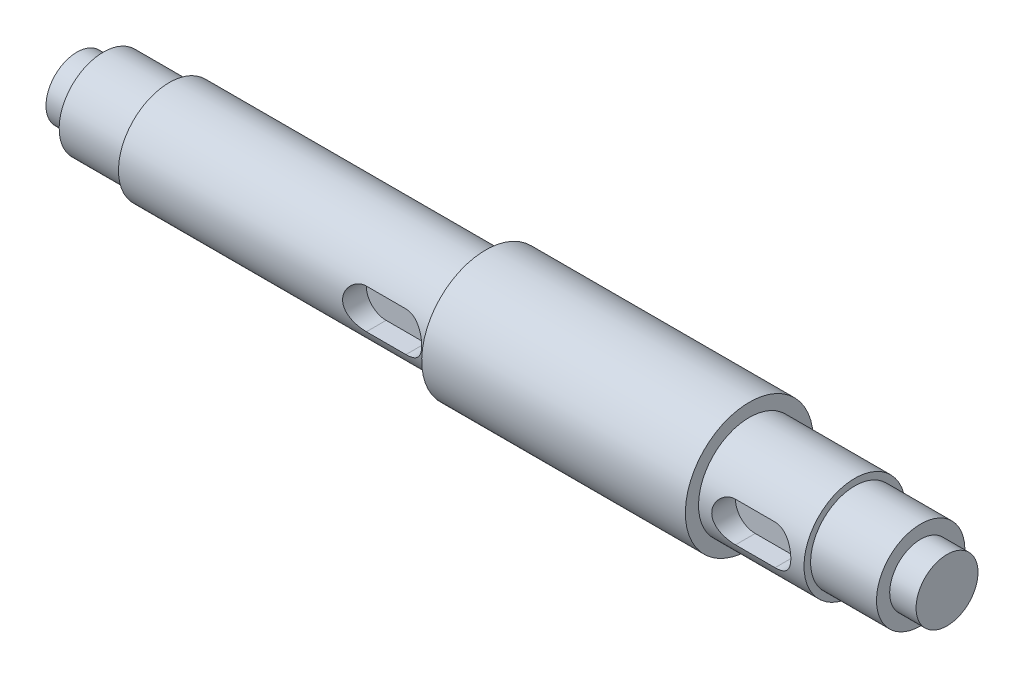
ISO-10303-21;
HEADER;
FILE_DESCRIPTION(('STEP AP214'),'2;1');
FILE_NAME('part.step','',(''),(''),'','','');
FILE_SCHEMA(('AUTOMOTIVE_DESIGN { 1 0 10303 214 1 1 1 1 }'));
ENDSEC;
DATA;
#1=APPLICATION_CONTEXT('core data for automotive mechanical design processes');
#2=APPLICATION_PROTOCOL_DEFINITION('international standard','automotive_design',2000,#1);
#3=PRODUCT_CONTEXT('',#1,'mechanical');
#4=PRODUCT('Part','Part','',(#3));
#5=PRODUCT_RELATED_PRODUCT_CATEGORY('part','',(#4));
#6=PRODUCT_DEFINITION_FORMATION('','',#4);
#7=PRODUCT_DEFINITION_CONTEXT('part definition',#1,'design');
#8=PRODUCT_DEFINITION('design','',#6,#7);
#9=PRODUCT_DEFINITION_SHAPE('','',#8);
#10=(LENGTH_UNIT() NAMED_UNIT(*) SI_UNIT(.MILLI.,.METRE.));
#11=(NAMED_UNIT(*) PLANE_ANGLE_UNIT() SI_UNIT($,.RADIAN.));
#12=(NAMED_UNIT(*) SI_UNIT($,.STERADIAN.) SOLID_ANGLE_UNIT());
#13=UNCERTAINTY_MEASURE_WITH_UNIT(LENGTH_MEASURE(1.E-05),#10,'distance_accuracy_value','');
#14=(GEOMETRIC_REPRESENTATION_CONTEXT(3) GLOBAL_UNCERTAINTY_ASSIGNED_CONTEXT((#13)) GLOBAL_UNIT_ASSIGNED_CONTEXT((#10,
#11,#12)) REPRESENTATION_CONTEXT('',''));
#15=CARTESIAN_POINT('',(0.,0.,0.));
#16=DIRECTION('',(0.,0.,1.));
#17=DIRECTION('',(1.,0.,0.));
#18=AXIS2_PLACEMENT_3D('',#15,#16,#17);
#19=CARTESIAN_POINT('',(66.,0.,0.));
#20=DIRECTION('',(-1.,0.,0.));
#21=DIRECTION('',(0.,-1.,0.));
#22=AXIS2_PLACEMENT_3D('',#19,#20,#21);
#23=PLANE('',#22);
#24=CARTESIAN_POINT('',(66.,0.,0.));
#25=DIRECTION('',(-1.,0.,0.));
#26=DIRECTION('',(0.,-1.,0.));
#27=AXIS2_PLACEMENT_3D('',#24,#25,#26);
#28=CIRCLE('',#27,2.35);
#29=CARTESIAN_POINT('',(66.,-2.34999999999999,0.));
#30=VERTEX_POINT('',#29);
#31=EDGE_CURVE('E230',#30,#30,#28,.T.);
#32=ORIENTED_EDGE('',*,*,#31,.F.);
#33=EDGE_LOOP('',(#32));
#34=FACE_BOUND('',#33,.T.);
#35=ADVANCED_FACE('F42',(#34),#23,.F.);
#36=CARTESIAN_POINT('',(0.,0.,0.));
#37=DIRECTION('',(-1.,0.,0.));
#38=DIRECTION('',(0.,-1.,0.));
#39=AXIS2_PLACEMENT_3D('',#36,#37,#38);
#40=CYLINDRICAL_SURFACE('',#39,2.35);
#41=CARTESIAN_POINT('',(64.,0.,0.));
#42=DIRECTION('',(-1.,0.,0.));
#43=DIRECTION('',(0.,-1.,0.));
#44=AXIS2_PLACEMENT_3D('',#41,#42,#43);
#45=CIRCLE('',#44,2.35);
#46=CARTESIAN_POINT('',(64.,-2.34999999999999,0.));
#47=VERTEX_POINT('',#46);
#48=EDGE_CURVE('E226',#47,#47,#45,.T.);
#49=ORIENTED_EDGE('',*,*,#48,.F.);
#50=EDGE_LOOP('',(#49));
#51=FACE_BOUND('',#50,.T.);
#52=ORIENTED_EDGE('',*,*,#31,.T.);
#53=EDGE_LOOP('',(#52));
#54=FACE_BOUND('',#53,.T.);
#55=ADVANCED_FACE('F307',(#51,#54),#40,.T.);
#56=CARTESIAN_POINT('',(64.,2.35000000000001,0.));
#57=DIRECTION('',(-1.,0.,0.));
#58=DIRECTION('',(0.,-1.,0.));
#59=AXIS2_PLACEMENT_3D('',#56,#57,#58);
#60=PLANE('',#59);
#61=CARTESIAN_POINT('',(64.,0.,0.));
#62=DIRECTION('',(-1.,0.,0.));
#63=DIRECTION('',(0.,-1.,0.));
#64=AXIS2_PLACEMENT_3D('',#61,#62,#63);
#65=CIRCLE('',#64,3.35);
#66=CARTESIAN_POINT('',(64.,-3.34999999999999,0.));
#67=VERTEX_POINT('',#66);
#68=EDGE_CURVE('E222',#67,#67,#65,.T.);
#69=ORIENTED_EDGE('',*,*,#68,.F.);
#70=EDGE_LOOP('',(#69));
#71=FACE_BOUND('',#70,.T.);
#72=ORIENTED_EDGE('',*,*,#48,.T.);
#73=EDGE_LOOP('',(#72));
#74=FACE_BOUND('',#73,.T.);
#75=ADVANCED_FACE('F304',(#71,#74),#60,.F.);
#76=CARTESIAN_POINT('',(0.,0.,0.));
#77=DIRECTION('',(-1.,0.,0.));
#78=DIRECTION('',(0.,-1.,0.));
#79=AXIS2_PLACEMENT_3D('',#76,#77,#78);
#80=CYLINDRICAL_SURFACE('',#79,3.35);
#81=CARTESIAN_POINT('',(59.,0.,0.));
#82=DIRECTION('',(-1.,0.,0.));
#83=DIRECTION('',(0.,-1.,0.));
#84=AXIS2_PLACEMENT_3D('',#81,#82,#83);
#85=CIRCLE('',#84,3.35);
#86=CARTESIAN_POINT('',(59.,-3.34999999999999,0.));
#87=VERTEX_POINT('',#86);
#88=EDGE_CURVE('E218',#87,#87,#85,.T.);
#89=ORIENTED_EDGE('',*,*,#88,.F.);
#90=EDGE_LOOP('',(#89));
#91=FACE_BOUND('',#90,.T.);
#92=ORIENTED_EDGE('',*,*,#68,.T.);
#93=EDGE_LOOP('',(#92));
#94=FACE_BOUND('',#93,.T.);
#95=ADVANCED_FACE('F300',(#91,#94),#80,.T.);
#96=CARTESIAN_POINT('',(59.,3.35000000000001,0.));
#97=DIRECTION('',(-1.,0.,0.));
#98=DIRECTION('',(0.,-1.,0.));
#99=AXIS2_PLACEMENT_3D('',#96,#97,#98);
#100=PLANE('',#99);
#101=CARTESIAN_POINT('',(59.,0.,0.));
#102=DIRECTION('',(-1.,0.,0.));
#103=DIRECTION('',(0.,-1.,0.));
#104=AXIS2_PLACEMENT_3D('',#101,#102,#103);
#105=CIRCLE('',#104,3.85);
#106=CARTESIAN_POINT('',(59.,-3.84999999999999,0.));
#107=VERTEX_POINT('',#106);
#108=EDGE_CURVE('E214',#107,#107,#105,.T.);
#109=ORIENTED_EDGE('',*,*,#108,.F.);
#110=EDGE_LOOP('',(#109));
#111=FACE_BOUND('',#110,.T.);
#112=ORIENTED_EDGE('',*,*,#88,.T.);
#113=EDGE_LOOP('',(#112));
#114=FACE_BOUND('',#113,.T.);
#115=ADVANCED_FACE('F294',(#111,#114),#100,.F.);
#116=CARTESIAN_POINT('',(0.,0.,0.));
#117=DIRECTION('',(-1.,0.,0.));
#118=DIRECTION('',(0.,-1.,0.));
#119=AXIS2_PLACEMENT_3D('',#116,#117,#118);
#120=CYLINDRICAL_SURFACE('',#119,3.85);
#121=DIRECTION('',(-1.,0.,0.));
#122=VECTOR('',#121,1.);
#123=CARTESIAN_POINT('',(0.,1.49999999999999,3.54577213029828));
#124=LINE('',#123,#122);
#125=CARTESIAN_POINT('',(53.5,1.5,3.54577213029828));
#126=VERTEX_POINT('',#125);
#127=CARTESIAN_POINT('',(56.5,1.5,3.54577213029828));
#128=VERTEX_POINT('',#127);
#129=EDGE_CURVE('E11',#126,#128,#124,.F.);
#130=ORIENTED_EDGE('',*,*,#129,.T.);
#131=CARTESIAN_POINT('',(56.5,1.5,3.54577213029828));
#132=CARTESIAN_POINT('',(56.5404618338618,1.50000164040419,3.54576703575081));
#133=CARTESIAN_POINT('',(56.5809024324145,1.49836178138949,3.54646558536955));
#134=CARTESIAN_POINT('',(56.6614595582847,1.49183230351774,3.54921897226671));
#135=CARTESIAN_POINT('',(56.70157619747,1.48694385967564,3.55127331915065));
#136=CARTESIAN_POINT('',(56.8206927524084,1.46751392009779,3.55936929335696));
#137=CARTESIAN_POINT('',(56.8988392785643,1.44820708834437,3.56734480341662));
#138=CARTESIAN_POINT('',(57.0504357755168,1.39764548174965,3.58745241051636));
#139=CARTESIAN_POINT('',(57.1238901559429,1.36640212344472,3.59958053469551));
#140=CARTESIAN_POINT('',(57.264597085254,1.29294049928526,3.62661464731073));
#141=CARTESIAN_POINT('',(57.3318440110146,1.25071241238868,3.64152311815889));
#142=CARTESIAN_POINT('',(57.4617614620834,1.15407328933463,3.67332554640512));
#143=CARTESIAN_POINT('',(57.524050624393,1.0991698190246,3.69028079080518));
#144=CARTESIAN_POINT('',(57.6388093575425,0.979781046049675,3.7237574683697));
#145=CARTESIAN_POINT('',(57.6912769625459,0.915293829771274,3.74027881411937));
#146=CARTESIAN_POINT('',(57.7867941045064,0.775615103417484,3.77176705811235));
#147=CARTESIAN_POINT('',(57.8294210039416,0.700114776143988,3.78665333516022));
#148=CARTESIAN_POINT('',(57.9012060188858,0.542332835730968,3.81244687113201));
#149=CARTESIAN_POINT('',(57.9303695015049,0.460053940268647,3.82335571527044));
#150=CARTESIAN_POINT('',(57.9730398831874,0.295081931461637,3.83952789515914));
#151=CARTESIAN_POINT('',(57.9872078149071,0.212583541075581,3.84502874987489));
#152=CARTESIAN_POINT('',(58.0016092058095,0.0462075338463993,3.85062113727988));
#153=CARTESIAN_POINT('',(58.0018473249002,-0.0376696123722565,3.85071447893184));
#154=CARTESIAN_POINT('',(57.9887536563041,-0.19965931488734,3.84562839212974));
#155=CARTESIAN_POINT('',(57.9761449932813,-0.277840714797592,3.84072994118146));
#156=CARTESIAN_POINT('',(57.9389401906249,-0.430875286721819,3.82658521016436));
#157=CARTESIAN_POINT('',(57.9143433708306,-0.505728269631625,3.817338683404));
#158=CARTESIAN_POINT('',(57.8535549106408,-0.65131128809086,3.79523386480986));
#159=CARTESIAN_POINT('',(57.8171960346122,-0.721963312482467,3.78232383090937));
#160=CARTESIAN_POINT('',(57.7340678666775,-0.85634353636994,3.75418381500692));
#161=CARTESIAN_POINT('',(57.687295025815,-0.920069364456069,3.73895304268455));
#162=CARTESIAN_POINT('',(57.5812511316371,-1.0430206871977,3.70660217968617));
#163=CARTESIAN_POINT('',(57.5213810297274,-1.10171482486283,3.68942350329647));
#164=CARTESIAN_POINT('',(57.3925535188711,-1.20844849080841,3.65585698692102));
#165=CARTESIAN_POINT('',(57.3235922449379,-1.25648346405465,3.63946948736439));
#166=CARTESIAN_POINT('',(57.176265075642,-1.34167604841726,3.60894887968111));
#167=CARTESIAN_POINT('',(57.0977005964541,-1.37851680710916,3.5948858282571));
#168=CARTESIAN_POINT('',(56.9348299857797,-1.43819771281013,3.57143256106451));
#169=CARTESIAN_POINT('',(56.8505340691867,-1.4610620783394,3.56203426747366));
#170=CARTESIAN_POINT('',(56.7211460768113,-1.48427310870374,3.55239335499112));
#171=CARTESIAN_POINT('',(56.6771474608967,-1.49016382582635,3.54992108625409));
#172=CARTESIAN_POINT('',(56.5887748663271,-1.49802715152491,3.54660726904934));
#173=CARTESIAN_POINT('',(56.544401197232,-1.5000027244758,3.54576448681793));
#174=CARTESIAN_POINT('',(56.5,-1.5,3.54577213029827));
#175=B_SPLINE_CURVE_WITH_KNOTS('',3,(#131,#132,#133,#134,#135,#136,#137,#138,#139,#140,#141,
#142,#143,#144,#145,#146,#147,#148,#149,#150,#151,#152,#153,#154,#155,#156,#157,#158,#159,#160,
#161,#162,#163,#164,#165,#166,#167,#168,#169,#170,#171,#172,#173,#174),.UNSPECIFIED.,.F.,.F.,(4,
2,2,2,2,2,2,2,2,2,2,2,2,2,2,2,2,2,2,2,2,4),(0.,0.121305110489596,0.242566368716422,
0.48396447722946,0.725132279313493,0.966516446213806,1.21963438983751,1.47280294230655,
1.73538325675409,1.99785880455712,2.24820907148589,2.49847558884061,2.73539319831473,
2.97232425112016,3.21278412705828,3.45332607465433,3.70892421117192,3.9646313642755,
4.2270168939421,4.48894645921971,4.62214608255748,4.75524481440902),.UNSPECIFIED.);
#176=CARTESIAN_POINT('',(56.5,-1.5,3.54577213029827));
#177=VERTEX_POINT('',#176);
#178=EDGE_CURVE('E282',#128,#177,#175,.T.);
#179=ORIENTED_EDGE('',*,*,#178,.T.);
#180=DIRECTION('',(-1.,0.,0.));
#181=VECTOR('',#180,1.);
#182=CARTESIAN_POINT('',(0.,-1.50000000000001,3.54577213029827));
#183=LINE('',#182,#181);
#184=CARTESIAN_POINT('',(53.5,-1.5,3.54577213029827));
#185=VERTEX_POINT('',#184);
#186=EDGE_CURVE('E50',#177,#185,#183,.T.);
#187=ORIENTED_EDGE('',*,*,#186,.T.);
#188=CARTESIAN_POINT('',(53.5,-1.5,3.54577213029827));
#189=CARTESIAN_POINT('',(53.4595381661383,-1.50000164040419,3.54576703575081));
#190=CARTESIAN_POINT('',(53.4190975675855,-1.4983617813895,3.54646558536955));
#191=CARTESIAN_POINT('',(53.3385404417154,-1.49183230351774,3.54921897226671));
#192=CARTESIAN_POINT('',(53.29842380253,-1.48694385967564,3.55127331915064));
#193=CARTESIAN_POINT('',(53.1793072475916,-1.46751392009779,3.55936929335696));
#194=CARTESIAN_POINT('',(53.1011607214357,-1.44820708834437,3.56734480341661));
#195=CARTESIAN_POINT('',(52.9495642244832,-1.39764548174965,3.58745241051636));
#196=CARTESIAN_POINT('',(52.8761098440571,-1.36640212344472,3.59958053469551));
#197=CARTESIAN_POINT('',(52.735402914746,-1.29294049928526,3.62661464731073));
#198=CARTESIAN_POINT('',(52.6681559889854,-1.25071241238868,3.64152311815889));
#199=CARTESIAN_POINT('',(52.5382385379166,-1.15407328933463,3.67332554640511));
#200=CARTESIAN_POINT('',(52.475949375607,-1.0991698190246,3.69028079080518));
#201=CARTESIAN_POINT('',(52.3611906424575,-0.979781046049677,3.7237574683697));
#202=CARTESIAN_POINT('',(52.3087230374541,-0.915293829771276,3.74027881411936));
#203=CARTESIAN_POINT('',(52.2132058954936,-0.775615103417485,3.77176705811234));
#204=CARTESIAN_POINT('',(52.1705789960584,-0.700114776143988,3.78665333516021));
#205=CARTESIAN_POINT('',(52.0987939811142,-0.542332835730968,3.81244687113201));
#206=CARTESIAN_POINT('',(52.0696304984951,-0.460053940268648,3.82335571527043));
#207=CARTESIAN_POINT('',(52.0269601168126,-0.295081931461637,3.83952789515914));
#208=CARTESIAN_POINT('',(52.012792185093,-0.212583541075582,3.84502874987489));
#209=CARTESIAN_POINT('',(51.9983907941905,-0.0462075338463994,3.85062113727988));
#210=CARTESIAN_POINT('',(51.9981526750998,0.0376696123722564,3.85071447893184));
#211=CARTESIAN_POINT('',(52.0112463436959,0.19965931488734,3.84562839212974));
#212=CARTESIAN_POINT('',(52.0238550067187,0.277840714797592,3.84072994118146));
#213=CARTESIAN_POINT('',(52.0610598093751,0.430875286721819,3.82658521016437));
#214=CARTESIAN_POINT('',(52.0856566291694,0.505728269631625,3.817338683404));
#215=CARTESIAN_POINT('',(52.1464450893592,0.65131128809086,3.79523386480986));
#216=CARTESIAN_POINT('',(52.1828039653878,0.721963312482466,3.78232383090937));
#217=CARTESIAN_POINT('',(52.2659321333225,0.85634353636994,3.75418381500692));
#218=CARTESIAN_POINT('',(52.312704974185,0.920069364456069,3.73895304268455));
#219=CARTESIAN_POINT('',(52.4187488683629,1.0430206871977,3.70660217968618));
#220=CARTESIAN_POINT('',(52.4786189702726,1.10171482486283,3.68942350329648));
#221=CARTESIAN_POINT('',(52.6074464811289,1.20844849080841,3.65585698692103));
#222=CARTESIAN_POINT('',(52.6764077550622,1.25648346405465,3.63946948736439));
#223=CARTESIAN_POINT('',(52.823734924358,1.34167604841727,3.60894887968111));
#224=CARTESIAN_POINT('',(52.9022994035459,1.37851680710916,3.59488582825711));
#225=CARTESIAN_POINT('',(53.0651700142203,1.43819771281014,3.57143256106451));
#226=CARTESIAN_POINT('',(53.1494659308133,1.4610620783394,3.56203426747367));
#227=CARTESIAN_POINT('',(53.2788539231888,1.48427310870374,3.55239335499113));
#228=CARTESIAN_POINT('',(53.3228525391033,1.49016382582635,3.54992108625409));
#229=CARTESIAN_POINT('',(53.4112251336729,1.49802715152491,3.54660726904935));
#230=CARTESIAN_POINT('',(53.455598802768,1.5000027244758,3.54576448681793));
#231=CARTESIAN_POINT('',(53.5,1.5,3.54577213029828));
#232=B_SPLINE_CURVE_WITH_KNOTS('',3,(#188,#189,#190,#191,#192,#193,#194,#195,#196,#197,#198,
#199,#200,#201,#202,#203,#204,#205,#206,#207,#208,#209,#210,#211,#212,#213,#214,#215,#216,#217,
#218,#219,#220,#221,#222,#223,#224,#225,#226,#227,#228,#229,#230,#231),.UNSPECIFIED.,.F.,.F.,(4,
2,2,2,2,2,2,2,2,2,2,2,2,2,2,2,2,2,2,2,2,4),(0.,0.121305110489596,0.242566368716422,
0.48396447722946,0.725132279313493,0.966516446213806,1.21963438983751,1.47280294230655,
1.73538325675409,1.99785880455712,2.24820907148589,2.49847558884061,2.73539319831473,
2.97232425112016,3.21278412705828,3.45332607465433,3.70892421117192,3.9646313642755,
4.22701689394213,4.48894645921971,4.62214608255748,4.75524481440901),.UNSPECIFIED.);
#233=EDGE_CURVE('E57',#185,#126,#232,.T.);
#234=ORIENTED_EDGE('',*,*,#233,.T.);
#235=EDGE_LOOP('',(#130,#179,#187,#234));
#236=FACE_BOUND('',#235,.T.);
#237=CARTESIAN_POINT('',(51.,0.,0.));
#238=DIRECTION('',(-1.,0.,0.));
#239=DIRECTION('',(0.,-1.,0.));
#240=AXIS2_PLACEMENT_3D('',#237,#238,#239);
#241=CIRCLE('',#240,3.84999999999999);
#242=CARTESIAN_POINT('',(51.,-3.84999999999999,0.));
#243=VERTEX_POINT('',#242);
#244=EDGE_CURVE('E210',#243,#243,#241,.T.);
#245=ORIENTED_EDGE('',*,*,#244,.F.);
#246=EDGE_LOOP('',(#245));
#247=FACE_BOUND('',#246,.T.);
#248=ORIENTED_EDGE('',*,*,#108,.T.);
#249=EDGE_LOOP('',(#248));
#250=FACE_BOUND('',#249,.T.);
#251=ADVANCED_FACE('F288',(#236,#247,#250),#120,.T.);
#252=CARTESIAN_POINT('',(51.,4.85,0.));
#253=DIRECTION('',(-1.,0.,0.));
#254=DIRECTION('',(0.,-1.,0.));
#255=AXIS2_PLACEMENT_3D('',#252,#253,#254);
#256=PLANE('',#255);
#257=CARTESIAN_POINT('',(51.,0.,0.));
#258=DIRECTION('',(-1.,0.,0.));
#259=DIRECTION('',(0.,-1.,0.));
#260=AXIS2_PLACEMENT_3D('',#257,#258,#259);
#261=CIRCLE('',#260,4.84999999999999);
#262=CARTESIAN_POINT('',(51.,-4.84999999999999,0.));
#263=VERTEX_POINT('',#262);
#264=EDGE_CURVE('E206',#263,#263,#261,.T.);
#265=ORIENTED_EDGE('',*,*,#264,.F.);
#266=EDGE_LOOP('',(#265));
#267=FACE_BOUND('',#266,.T.);
#268=ORIENTED_EDGE('',*,*,#244,.T.);
#269=EDGE_LOOP('',(#268));
#270=FACE_BOUND('',#269,.T.);
#271=ADVANCED_FACE('F293',(#267,#270),#256,.F.);
#272=CARTESIAN_POINT('',(0.,0.,0.));
#273=DIRECTION('',(-1.,0.,0.));
#274=DIRECTION('',(0.,-1.,0.));
#275=AXIS2_PLACEMENT_3D('',#272,#273,#274);
#276=CYLINDRICAL_SURFACE('',#275,4.85);
#277=CARTESIAN_POINT('',(31.,0.,0.));
#278=DIRECTION('',(-1.,0.,0.));
#279=DIRECTION('',(0.,-1.,0.));
#280=AXIS2_PLACEMENT_3D('',#277,#278,#279);
#281=CIRCLE('',#280,4.85);
#282=CARTESIAN_POINT('',(31.,-4.84999999999999,0.));
#283=VERTEX_POINT('',#282);
#284=EDGE_CURVE('E202',#283,#283,#281,.T.);
#285=ORIENTED_EDGE('',*,*,#284,.F.);
#286=EDGE_LOOP('',(#285));
#287=FACE_BOUND('',#286,.T.);
#288=ORIENTED_EDGE('',*,*,#264,.T.);
#289=EDGE_LOOP('',(#288));
#290=FACE_BOUND('',#289,.T.);
#291=ADVANCED_FACE('F353',(#287,#290),#276,.T.);
#292=CARTESIAN_POINT('',(31.,4.85,0.));
#293=DIRECTION('',(1.,0.,0.));
#294=DIRECTION('',(0.,1.,0.));
#295=AXIS2_PLACEMENT_3D('',#292,#293,#294);
#296=PLANE('',#295);
#297=CARTESIAN_POINT('',(31.,0.,0.));
#298=DIRECTION('',(-1.,0.,0.));
#299=DIRECTION('',(0.,-1.,0.));
#300=AXIS2_PLACEMENT_3D('',#297,#298,#299);
#301=CIRCLE('',#300,3.85);
#302=CARTESIAN_POINT('',(31.,-3.84999999999999,0.));
#303=VERTEX_POINT('',#302);
#304=EDGE_CURVE('E198',#303,#303,#301,.T.);
#305=ORIENTED_EDGE('',*,*,#304,.F.);
#306=EDGE_LOOP('',(#305));
#307=FACE_BOUND('',#306,.T.);
#308=ORIENTED_EDGE('',*,*,#284,.T.);
#309=EDGE_LOOP('',(#308));
#310=FACE_BOUND('',#309,.T.);
#311=ADVANCED_FACE('F361',(#307,#310),#296,.F.);
#312=CARTESIAN_POINT('',(0.,0.,0.));
#313=DIRECTION('',(-1.,0.,0.));
#314=DIRECTION('',(0.,-1.,0.));
#315=AXIS2_PLACEMENT_3D('',#312,#313,#314);
#316=CYLINDRICAL_SURFACE('',#315,3.85);
#317=DIRECTION('',(-1.,0.,0.));
#318=VECTOR('',#317,1.);
#319=CARTESIAN_POINT('',(0.,1.49999999999999,3.54577213029828));
#320=LINE('',#319,#318);
#321=CARTESIAN_POINT('',(25.5,1.5,3.54577213029828));
#322=VERTEX_POINT('',#321);
#323=CARTESIAN_POINT('',(28.5,1.5,3.54577213029828));
#324=VERTEX_POINT('',#323);
#325=EDGE_CURVE('E596',#322,#324,#320,.F.);
#326=ORIENTED_EDGE('',*,*,#325,.T.);
#327=CARTESIAN_POINT('',(28.5,1.5,3.54577213029828));
#328=CARTESIAN_POINT('',(28.5404618338618,1.50000164040419,3.54576703575081));
#329=CARTESIAN_POINT('',(28.5809024324145,1.49836178138949,3.54646558536955));
#330=CARTESIAN_POINT('',(28.6614595582846,1.49183230351774,3.54921897226671));
#331=CARTESIAN_POINT('',(28.70157619747,1.48694385967564,3.55127331915065));
#332=CARTESIAN_POINT('',(28.8206927524084,1.46751392009779,3.55936929335696));
#333=CARTESIAN_POINT('',(28.8988392785643,1.44820708834437,3.56734480341662));
#334=CARTESIAN_POINT('',(29.0504357755168,1.39764548174965,3.58745241051636));
#335=CARTESIAN_POINT('',(29.1238901559429,1.36640212344472,3.59958053469551));
#336=CARTESIAN_POINT('',(29.264597085254,1.29294049928526,3.62661464731073));
#337=CARTESIAN_POINT('',(29.3318440110146,1.25071241238869,3.64152311815889));
#338=CARTESIAN_POINT('',(29.4617614620834,1.15407328933463,3.67332554640512));
#339=CARTESIAN_POINT('',(29.524050624393,1.09916981902461,3.69028079080518));
#340=CARTESIAN_POINT('',(29.6388093575425,0.979781046049681,3.7237574683697));
#341=CARTESIAN_POINT('',(29.6912769625459,0.915293829771277,3.74027881411937));
#342=CARTESIAN_POINT('',(29.7867941045064,0.775615103417484,3.77176705811235));
#343=CARTESIAN_POINT('',(29.8294210039416,0.700114776143988,3.78665333516022));
#344=CARTESIAN_POINT('',(29.9012060188858,0.542332835730968,3.81244687113202));
#345=CARTESIAN_POINT('',(29.9303695015049,0.460053940268648,3.82335571527044));
#346=CARTESIAN_POINT('',(29.9730398831875,0.295081931461637,3.83952789515914));
#347=CARTESIAN_POINT('',(29.987207814907,0.212583541075581,3.84502874987489));
#348=CARTESIAN_POINT('',(30.0016092058095,0.0462075338463982,3.85062113727989));
#349=CARTESIAN_POINT('',(30.0018473249003,-0.0376696123722577,3.85071447893185));
#350=CARTESIAN_POINT('',(29.9887536563041,-0.199659314887341,3.84562839212974));
#351=CARTESIAN_POINT('',(29.9761449932813,-0.277840714797591,3.84072994118146));
#352=CARTESIAN_POINT('',(29.9389401906249,-0.430875286721818,3.82658521016437));
#353=CARTESIAN_POINT('',(29.9143433708306,-0.505728269631626,3.817338683404));
#354=CARTESIAN_POINT('',(29.8535549106408,-0.651311288090862,3.79523386480986));
#355=CARTESIAN_POINT('',(29.8171960346122,-0.721963312482468,3.78232383090937));
#356=CARTESIAN_POINT('',(29.7340678666775,-0.856343536369941,3.75418381500692));
#357=CARTESIAN_POINT('',(29.687295025815,-0.92006936445607,3.73895304268455));
#358=CARTESIAN_POINT('',(29.5812511316371,-1.0430206871977,3.70660217968618));
#359=CARTESIAN_POINT('',(29.5213810297274,-1.10171482486284,3.68942350329647));
#360=CARTESIAN_POINT('',(29.3925535188711,-1.20844849080842,3.65585698692103));
#361=CARTESIAN_POINT('',(29.3235922449379,-1.25648346405465,3.63946948736439));
#362=CARTESIAN_POINT('',(29.176265075642,-1.34167604841727,3.60894887968111));
#363=CARTESIAN_POINT('',(29.0977005964541,-1.37851680710916,3.59488582825711));
#364=CARTESIAN_POINT('',(28.9348299857797,-1.43819771281013,3.57143256106451));
#365=CARTESIAN_POINT('',(28.8505340691867,-1.4610620783394,3.56203426747366));
#366=CARTESIAN_POINT('',(28.7211460768113,-1.48427310870374,3.55239335499113));
#367=CARTESIAN_POINT('',(28.6771474608967,-1.49016382582635,3.54992108625409));
#368=CARTESIAN_POINT('',(28.5887748663271,-1.49802715152491,3.54660726904935));
#369=CARTESIAN_POINT('',(28.544401197232,-1.5000027244758,3.54576448681793));
#370=CARTESIAN_POINT('',(28.5,-1.5,3.54577213029828));
#371=B_SPLINE_CURVE_WITH_KNOTS('',3,(#327,#328,#329,#330,#331,#332,#333,#334,#335,#336,#337,
#338,#339,#340,#341,#342,#343,#344,#345,#346,#347,#348,#349,#350,#351,#352,#353,#354,#355,#356,
#357,#358,#359,#360,#361,#362,#363,#364,#365,#366,#367,#368,#369,#370),.UNSPECIFIED.,.F.,.F.,(4,
2,2,2,2,2,2,2,2,2,2,2,2,2,2,2,2,2,2,2,2,4),(0.,0.121305110489596,0.242566368716421,
0.48396447722946,0.725132279313482,0.966516446213794,1.2196343898375,1.47280294230655,
1.7353832567541,1.99785880455712,2.24820907148589,2.49847558884061,2.73539319831473,
2.97232425112016,3.21278412705829,3.45332607465434,3.70892421117192,3.96463136427551,
4.22701689394211,4.48894645921971,4.6221460825575,4.75524481440903),.UNSPECIFIED.);
#372=CARTESIAN_POINT('',(28.5,-1.5,3.54577213029828));
#373=VERTEX_POINT('',#372);
#374=EDGE_CURVE('E234',#324,#373,#371,.T.);
#375=ORIENTED_EDGE('',*,*,#374,.T.);
#376=DIRECTION('',(-1.,0.,0.));
#377=VECTOR('',#376,1.);
#378=CARTESIAN_POINT('',(0.,-1.50000000000001,3.54577213029828));
#379=LINE('',#378,#377);
#380=CARTESIAN_POINT('',(25.5,-1.5,3.54577213029828));
#381=VERTEX_POINT('',#380);
#382=EDGE_CURVE('E595',#373,#381,#379,.T.);
#383=ORIENTED_EDGE('',*,*,#382,.T.);
#384=CARTESIAN_POINT('',(25.5,-1.5,3.54577213029828));
#385=CARTESIAN_POINT('',(25.4595381661382,-1.50000164040419,3.54576703575081));
#386=CARTESIAN_POINT('',(25.4190975675855,-1.4983617813895,3.54646558536955));
#387=CARTESIAN_POINT('',(25.3385404417154,-1.49183230351774,3.54921897226671));
#388=CARTESIAN_POINT('',(25.29842380253,-1.48694385967564,3.55127331915065));
#389=CARTESIAN_POINT('',(25.1793072475916,-1.46751392009779,3.55936929335696));
#390=CARTESIAN_POINT('',(25.1011607214357,-1.44820708834437,3.56734480341661));
#391=CARTESIAN_POINT('',(24.9495642244832,-1.39764548174965,3.58745241051636));
#392=CARTESIAN_POINT('',(24.8761098440571,-1.36640212344472,3.59958053469551));
#393=CARTESIAN_POINT('',(24.735402914746,-1.29294049928526,3.62661464731073));
#394=CARTESIAN_POINT('',(24.6681559889854,-1.25071241238869,3.64152311815889));
#395=CARTESIAN_POINT('',(24.5382385379166,-1.15407328933464,3.67332554640511));
#396=CARTESIAN_POINT('',(24.475949375607,-1.09916981902461,3.69028079080518));
#397=CARTESIAN_POINT('',(24.3611906424575,-0.979781046049681,3.7237574683697));
#398=CARTESIAN_POINT('',(24.3087230374541,-0.915293829771278,3.74027881411936));
#399=CARTESIAN_POINT('',(24.2132058954936,-0.775615103417484,3.77176705811235));
#400=CARTESIAN_POINT('',(24.1705789960584,-0.700114776143988,3.78665333516022));
#401=CARTESIAN_POINT('',(24.0987939811142,-0.542332835730968,3.81244687113201));
#402=CARTESIAN_POINT('',(24.0696304984951,-0.460053940268648,3.82335571527044));
#403=CARTESIAN_POINT('',(24.0269601168126,-0.295081931461637,3.83952789515914));
#404=CARTESIAN_POINT('',(24.012792185093,-0.212583541075581,3.84502874987489));
#405=CARTESIAN_POINT('',(23.9983907941905,-0.0462075338463983,3.85062113727989));
#406=CARTESIAN_POINT('',(23.9981526750998,0.0376696123722578,3.85071447893185));
#407=CARTESIAN_POINT('',(24.0112463436959,0.199659314887341,3.84562839212974));
#408=CARTESIAN_POINT('',(24.0238550067187,0.277840714797591,3.84072994118146));
#409=CARTESIAN_POINT('',(24.0610598093751,0.430875286721819,3.82658521016437));
#410=CARTESIAN_POINT('',(24.0856566291694,0.505728269631626,3.817338683404));
#411=CARTESIAN_POINT('',(24.1464450893592,0.651311288090863,3.79523386480986));
#412=CARTESIAN_POINT('',(24.1828039653878,0.721963312482469,3.78232383090937));
#413=CARTESIAN_POINT('',(24.2659321333225,0.856343536369941,3.75418381500693));
#414=CARTESIAN_POINT('',(24.312704974185,0.92006936445607,3.73895304268455));
#415=CARTESIAN_POINT('',(24.4187488683629,1.0430206871977,3.70660217968618));
#416=CARTESIAN_POINT('',(24.4786189702727,1.10171482486284,3.68942350329648));
#417=CARTESIAN_POINT('',(24.6074464811289,1.20844849080842,3.65585698692103));
#418=CARTESIAN_POINT('',(24.6764077550622,1.25648346405465,3.63946948736439));
#419=CARTESIAN_POINT('',(24.823734924358,1.34167604841727,3.60894887968111));
#420=CARTESIAN_POINT('',(24.9022994035459,1.37851680710916,3.59488582825711));
#421=CARTESIAN_POINT('',(25.0651700142203,1.43819771281013,3.57143256106451));
#422=CARTESIAN_POINT('',(25.1494659308133,1.4610620783394,3.56203426747367));
#423=CARTESIAN_POINT('',(25.2788539231888,1.48427310870374,3.55239335499113));
#424=CARTESIAN_POINT('',(25.3228525391033,1.49016382582635,3.54992108625409));
#425=CARTESIAN_POINT('',(25.4112251336729,1.49802715152491,3.54660726904935));
#426=CARTESIAN_POINT('',(25.455598802768,1.5000027244758,3.54576448681793));
#427=CARTESIAN_POINT('',(25.5,1.5,3.54577213029828));
#428=B_SPLINE_CURVE_WITH_KNOTS('',3,(#384,#385,#386,#387,#388,#389,#390,#391,#392,#393,#394,
#395,#396,#397,#398,#399,#400,#401,#402,#403,#404,#405,#406,#407,#408,#409,#410,#411,#412,#413,
#414,#415,#416,#417,#418,#419,#420,#421,#422,#423,#424,#425,#426,#427),.UNSPECIFIED.,.F.,.F.,(4,
2,2,2,2,2,2,2,2,2,2,2,2,2,2,2,2,2,2,2,2,4),(0.,0.121305110489596,0.242566368716421,
0.48396447722946,0.725132279313482,0.96651644621379,1.2196343898375,1.47280294230655,
1.7353832567541,1.99785880455712,2.2482090714859,2.49847558884061,2.73539319831473,
2.97232425112016,3.21278412705829,3.45332607465434,3.70892421117192,3.96463136427551,
4.22701689394212,4.48894645921971,4.6221460825575,4.75524481440903),.UNSPECIFIED.);
#429=EDGE_CURVE('E65',#381,#322,#428,.T.);
#430=ORIENTED_EDGE('',*,*,#429,.T.);
#431=EDGE_LOOP('',(#326,#375,#383,#430));
#432=FACE_BOUND('',#431,.T.);
#433=CARTESIAN_POINT('',(7.,0.,0.));
#434=DIRECTION('',(-1.,0.,0.));
#435=DIRECTION('',(0.,-1.,0.));
#436=AXIS2_PLACEMENT_3D('',#433,#434,#435);
#437=CIRCLE('',#436,3.85);
#438=CARTESIAN_POINT('',(7.,-3.85,0.));
#439=VERTEX_POINT('',#438);
#440=EDGE_CURVE('E194',#439,#439,#437,.T.);
#441=ORIENTED_EDGE('',*,*,#440,.F.);
#442=EDGE_LOOP('',(#441));
#443=FACE_BOUND('',#442,.T.);
#444=ORIENTED_EDGE('',*,*,#304,.T.);
#445=EDGE_LOOP('',(#444));
#446=FACE_BOUND('',#445,.T.);
#447=ADVANCED_FACE('F250',(#432,#443,#446),#316,.T.);
#448=CARTESIAN_POINT('',(7.,3.35,0.));
#449=DIRECTION('',(1.,0.,0.));
#450=DIRECTION('',(0.,1.,0.));
#451=AXIS2_PLACEMENT_3D('',#448,#449,#450);
#452=PLANE('',#451);
#453=CARTESIAN_POINT('',(7.,0.,0.));
#454=DIRECTION('',(-1.,0.,0.));
#455=DIRECTION('',(0.,-1.,0.));
#456=AXIS2_PLACEMENT_3D('',#453,#454,#455);
#457=CIRCLE('',#456,3.35);
#458=CARTESIAN_POINT('',(7.,-3.35,0.));
#459=VERTEX_POINT('',#458);
#460=EDGE_CURVE('E190',#459,#459,#457,.T.);
#461=ORIENTED_EDGE('',*,*,#460,.F.);
#462=EDGE_LOOP('',(#461));
#463=FACE_BOUND('',#462,.T.);
#464=ORIENTED_EDGE('',*,*,#440,.T.);
#465=EDGE_LOOP('',(#464));
#466=FACE_BOUND('',#465,.T.);
#467=ADVANCED_FACE('F376',(#463,#466),#452,.F.);
#468=CARTESIAN_POINT('',(0.,0.,0.));
#469=DIRECTION('',(-1.,0.,0.));
#470=DIRECTION('',(0.,-1.,0.));
#471=AXIS2_PLACEMENT_3D('',#468,#469,#470);
#472=CYLINDRICAL_SURFACE('',#471,3.35);
#473=CARTESIAN_POINT('',(2.,0.,0.));
#474=DIRECTION('',(-1.,0.,0.));
#475=DIRECTION('',(0.,-1.,0.));
#476=AXIS2_PLACEMENT_3D('',#473,#474,#475);
#477=CIRCLE('',#476,3.35);
#478=CARTESIAN_POINT('',(2.,-3.35,0.));
#479=VERTEX_POINT('',#478);
#480=EDGE_CURVE('E186',#479,#479,#477,.T.);
#481=ORIENTED_EDGE('',*,*,#480,.F.);
#482=EDGE_LOOP('',(#481));
#483=FACE_BOUND('',#482,.T.);
#484=ORIENTED_EDGE('',*,*,#460,.T.);
#485=EDGE_LOOP('',(#484));
#486=FACE_BOUND('',#485,.T.);
#487=ADVANCED_FACE('F384',(#483,#486),#472,.T.);
#488=CARTESIAN_POINT('',(2.,2.35,0.));
#489=DIRECTION('',(1.,0.,0.));
#490=DIRECTION('',(0.,1.,0.));
#491=AXIS2_PLACEMENT_3D('',#488,#489,#490);
#492=PLANE('',#491);
#493=CARTESIAN_POINT('',(2.,0.,0.));
#494=DIRECTION('',(-1.,0.,0.));
#495=DIRECTION('',(0.,-1.,0.));
#496=AXIS2_PLACEMENT_3D('',#493,#494,#495);
#497=CIRCLE('',#496,2.35);
#498=CARTESIAN_POINT('',(2.,-2.35,0.));
#499=VERTEX_POINT('',#498);
#500=EDGE_CURVE('E182',#499,#499,#497,.T.);
#501=ORIENTED_EDGE('',*,*,#500,.F.);
#502=EDGE_LOOP('',(#501));
#503=FACE_BOUND('',#502,.T.);
#504=ORIENTED_EDGE('',*,*,#480,.T.);
#505=EDGE_LOOP('',(#504));
#506=FACE_BOUND('',#505,.T.);
#507=ADVANCED_FACE('F392',(#503,#506),#492,.F.);
#508=CARTESIAN_POINT('',(0.,0.,0.));
#509=DIRECTION('',(-1.,0.,0.));
#510=DIRECTION('',(0.,-1.,0.));
#511=AXIS2_PLACEMENT_3D('',#508,#509,#510);
#512=CYLINDRICAL_SURFACE('',#511,2.35);
#513=CARTESIAN_POINT('',(0.,0.,0.));
#514=DIRECTION('',(-1.,0.,0.));
#515=DIRECTION('',(0.,-1.,0.));
#516=AXIS2_PLACEMENT_3D('',#513,#514,#515);
#517=CIRCLE('',#516,2.35);
#518=CARTESIAN_POINT('',(0.,-2.35,0.));
#519=VERTEX_POINT('',#518);
#520=EDGE_CURVE('E148',#519,#519,#517,.T.);
#521=ORIENTED_EDGE('',*,*,#520,.F.);
#522=EDGE_LOOP('',(#521));
#523=FACE_BOUND('',#522,.T.);
#524=ORIENTED_EDGE('',*,*,#500,.T.);
#525=EDGE_LOOP('',(#524));
#526=FACE_BOUND('',#525,.T.);
#527=ADVANCED_FACE('F401',(#523,#526),#512,.T.);
#528=CARTESIAN_POINT('',(0.,0.,0.));
#529=DIRECTION('',(1.,0.,0.));
#530=DIRECTION('',(0.,1.,0.));
#531=AXIS2_PLACEMENT_3D('',#528,#529,#530);
#532=PLANE('',#531);
#533=ORIENTED_EDGE('',*,*,#520,.T.);
#534=EDGE_LOOP('',(#533));
#535=FACE_BOUND('',#534,.T.);
#536=ADVANCED_FACE('F266',(#535),#532,.F.);
#537=CARTESIAN_POINT('',(25.5,0.,2.05));
#538=DIRECTION('',(0.,0.,1.));
#539=DIRECTION('',(1.,0.,0.));
#540=AXIS2_PLACEMENT_3D('',#537,#538,#539);
#541=CYLINDRICAL_SURFACE('',#540,1.5);
#542=DIRECTION('',(0.,0.,1.));
#543=VECTOR('',#542,1.);
#544=CARTESIAN_POINT('',(25.5,-1.5,2.05));
#545=LINE('',#544,#543);
#546=CARTESIAN_POINT('',(25.5,-1.5,2.05));
#547=VERTEX_POINT('',#546);
#548=EDGE_CURVE('E107',#547,#381,#545,.T.);
#549=ORIENTED_EDGE('',*,*,#548,.F.);
#550=CARTESIAN_POINT('',(25.5,0.,2.05));
#551=DIRECTION('',(0.,0.,1.));
#552=DIRECTION('',(1.,0.,0.));
#553=AXIS2_PLACEMENT_3D('',#550,#551,#552);
#554=CIRCLE('',#553,1.5);
#555=CARTESIAN_POINT('',(25.5,1.5,2.05));
#556=VERTEX_POINT('',#555);
#557=EDGE_CURVE('E111',#556,#547,#554,.T.);
#558=ORIENTED_EDGE('',*,*,#557,.F.);
#559=DIRECTION('',(0.,0.,1.));
#560=VECTOR('',#559,1.);
#561=CARTESIAN_POINT('',(25.5,1.5,2.05));
#562=LINE('',#561,#560);
#563=EDGE_CURVE('E145',#556,#322,#562,.T.);
#564=ORIENTED_EDGE('',*,*,#563,.T.);
#565=ORIENTED_EDGE('',*,*,#429,.F.);
#566=EDGE_LOOP('',(#549,#558,#564,#565));
#567=FACE_BOUND('',#566,.T.);
#568=ADVANCED_FACE('F109',(#567),#541,.F.);
#569=CARTESIAN_POINT('',(25.5,1.5,2.05));
#570=DIRECTION('',(0.,1.,0.));
#571=DIRECTION('',(-1.,0.,0.));
#572=AXIS2_PLACEMENT_3D('',#569,#570,#571);
#573=PLANE('',#572);
#574=ORIENTED_EDGE('',*,*,#563,.F.);
#575=DIRECTION('',(-1.,0.,0.));
#576=VECTOR('',#575,1.);
#577=CARTESIAN_POINT('',(25.5,1.5,2.05));
#578=LINE('',#577,#576);
#579=CARTESIAN_POINT('',(28.5,1.5,2.05));
#580=VERTEX_POINT('',#579);
#581=EDGE_CURVE('E117',#580,#556,#578,.T.);
#582=ORIENTED_EDGE('',*,*,#581,.F.);
#583=DIRECTION('',(0.,0.,1.));
#584=VECTOR('',#583,1.);
#585=CARTESIAN_POINT('',(28.5,1.5,2.05));
#586=LINE('',#585,#584);
#587=EDGE_CURVE('E149',#580,#324,#586,.T.);
#588=ORIENTED_EDGE('',*,*,#587,.T.);
#589=ORIENTED_EDGE('',*,*,#325,.F.);
#590=EDGE_LOOP('',(#574,#582,#588,#589));
#591=FACE_BOUND('',#590,.T.);
#592=ADVANCED_FACE('F259',(#591),#573,.F.);
#593=CARTESIAN_POINT('',(28.5,0.,2.05));
#594=DIRECTION('',(0.,0.,1.));
#595=DIRECTION('',(1.,0.,0.));
#596=AXIS2_PLACEMENT_3D('',#593,#594,#595);
#597=CYLINDRICAL_SURFACE('',#596,1.5);
#598=ORIENTED_EDGE('',*,*,#587,.F.);
#599=CARTESIAN_POINT('',(28.5,0.,2.05));
#600=DIRECTION('',(0.,0.,1.));
#601=DIRECTION('',(1.,0.,0.));
#602=AXIS2_PLACEMENT_3D('',#599,#600,#601);
#603=CIRCLE('',#602,1.5);
#604=CARTESIAN_POINT('',(28.5,-1.5,2.05));
#605=VERTEX_POINT('',#604);
#606=EDGE_CURVE('E127',#605,#580,#603,.T.);
#607=ORIENTED_EDGE('',*,*,#606,.F.);
#608=DIRECTION('',(0.,0.,1.));
#609=VECTOR('',#608,1.);
#610=CARTESIAN_POINT('',(28.5,-1.5,2.05));
#611=LINE('',#610,#609);
#612=EDGE_CURVE('E116',#605,#373,#611,.T.);
#613=ORIENTED_EDGE('',*,*,#612,.T.);
#614=ORIENTED_EDGE('',*,*,#374,.F.);
#615=EDGE_LOOP('',(#598,#607,#613,#614));
#616=FACE_BOUND('',#615,.T.);
#617=ADVANCED_FACE('F254',(#616),#597,.F.);
#618=CARTESIAN_POINT('',(25.5,-1.5,2.05));
#619=DIRECTION('',(0.,-1.,0.));
#620=DIRECTION('',(1.,0.,0.));
#621=AXIS2_PLACEMENT_3D('',#618,#619,#620);
#622=PLANE('',#621);
#623=ORIENTED_EDGE('',*,*,#612,.F.);
#624=DIRECTION('',(1.,0.,0.));
#625=VECTOR('',#624,1.);
#626=CARTESIAN_POINT('',(25.5,-1.5,2.05));
#627=LINE('',#626,#625);
#628=EDGE_CURVE('E120',#547,#605,#627,.T.);
#629=ORIENTED_EDGE('',*,*,#628,.F.);
#630=ORIENTED_EDGE('',*,*,#548,.T.);
#631=ORIENTED_EDGE('',*,*,#382,.F.);
#632=EDGE_LOOP('',(#623,#629,#630,#631));
#633=FACE_BOUND('',#632,.T.);
#634=ADVANCED_FACE('F121',(#633),#622,.F.);
#635=CARTESIAN_POINT('',(25.5,0.,2.05));
#636=DIRECTION('',(0.,0.,1.));
#637=DIRECTION('',(1.,0.,0.));
#638=AXIS2_PLACEMENT_3D('',#635,#636,#637);
#639=PLANE('',#638);
#640=ORIENTED_EDGE('',*,*,#557,.T.);
#641=ORIENTED_EDGE('',*,*,#628,.T.);
#642=ORIENTED_EDGE('',*,*,#606,.T.);
#643=ORIENTED_EDGE('',*,*,#581,.T.);
#644=EDGE_LOOP('',(#640,#641,#642,#643));
#645=FACE_BOUND('',#644,.T.);
#646=ADVANCED_FACE('F129',(#645),#639,.T.);
#647=CARTESIAN_POINT('',(53.5,0.,2.05));
#648=DIRECTION('',(0.,0.,1.));
#649=DIRECTION('',(1.,0.,0.));
#650=AXIS2_PLACEMENT_3D('',#647,#648,#649);
#651=CYLINDRICAL_SURFACE('',#650,1.5);
#652=DIRECTION('',(0.,0.,1.));
#653=VECTOR('',#652,1.);
#654=CARTESIAN_POINT('',(53.5,-1.5,2.05));
#655=LINE('',#654,#653);
#656=CARTESIAN_POINT('',(53.5,-1.5,2.05));
#657=VERTEX_POINT('',#656);
#658=EDGE_CURVE('E155',#657,#185,#655,.T.);
#659=ORIENTED_EDGE('',*,*,#658,.F.);
#660=CARTESIAN_POINT('',(53.5,0.,2.05));
#661=DIRECTION('',(0.,0.,1.));
#662=DIRECTION('',(1.,0.,0.));
#663=AXIS2_PLACEMENT_3D('',#660,#661,#662);
#664=CIRCLE('',#663,1.5);
#665=CARTESIAN_POINT('',(53.5,1.5,2.05));
#666=VERTEX_POINT('',#665);
#667=EDGE_CURVE('E132',#666,#657,#664,.T.);
#668=ORIENTED_EDGE('',*,*,#667,.F.);
#669=DIRECTION('',(0.,0.,1.));
#670=VECTOR('',#669,1.);
#671=CARTESIAN_POINT('',(53.5,1.5,2.05));
#672=LINE('',#671,#670);
#673=EDGE_CURVE('E167',#666,#126,#672,.T.);
#674=ORIENTED_EDGE('',*,*,#673,.T.);
#675=ORIENTED_EDGE('',*,*,#233,.F.);
#676=EDGE_LOOP('',(#659,#668,#674,#675));
#677=FACE_BOUND('',#676,.T.);
#678=ADVANCED_FACE('F267',(#677),#651,.F.);
#679=CARTESIAN_POINT('',(53.5,1.5,2.05));
#680=DIRECTION('',(0.,1.,0.));
#681=DIRECTION('',(-1.,0.,0.));
#682=AXIS2_PLACEMENT_3D('',#679,#680,#681);
#683=PLANE('',#682);
#684=ORIENTED_EDGE('',*,*,#673,.F.);
#685=DIRECTION('',(-1.,0.,0.));
#686=VECTOR('',#685,1.);
#687=CARTESIAN_POINT('',(53.5,1.5,2.05));
#688=LINE('',#687,#686);
#689=CARTESIAN_POINT('',(56.5,1.5,2.05));
#690=VERTEX_POINT('',#689);
#691=EDGE_CURVE('E158',#690,#666,#688,.T.);
#692=ORIENTED_EDGE('',*,*,#691,.F.);
#693=DIRECTION('',(0.,0.,1.));
#694=VECTOR('',#693,1.);
#695=CARTESIAN_POINT('',(56.5,1.5,2.05));
#696=LINE('',#695,#694);
#697=EDGE_CURVE('E163',#690,#128,#696,.T.);
#698=ORIENTED_EDGE('',*,*,#697,.T.);
#699=ORIENTED_EDGE('',*,*,#129,.F.);
#700=EDGE_LOOP('',(#684,#692,#698,#699));
#701=FACE_BOUND('',#700,.T.);
#702=ADVANCED_FACE('F271',(#701),#683,.F.);
#703=CARTESIAN_POINT('',(56.5,0.,2.05));
#704=DIRECTION('',(0.,0.,1.));
#705=DIRECTION('',(1.,0.,0.));
#706=AXIS2_PLACEMENT_3D('',#703,#704,#705);
#707=CYLINDRICAL_SURFACE('',#706,1.5);
#708=ORIENTED_EDGE('',*,*,#697,.F.);
#709=CARTESIAN_POINT('',(56.5,0.,2.05));
#710=DIRECTION('',(0.,0.,1.));
#711=DIRECTION('',(1.,0.,0.));
#712=AXIS2_PLACEMENT_3D('',#709,#710,#711);
#713=CIRCLE('',#712,1.5);
#714=CARTESIAN_POINT('',(56.5,-1.5,2.05));
#715=VERTEX_POINT('',#714);
#716=EDGE_CURVE('E172',#715,#690,#713,.T.);
#717=ORIENTED_EDGE('',*,*,#716,.F.);
#718=DIRECTION('',(0.,0.,1.));
#719=VECTOR('',#718,1.);
#720=CARTESIAN_POINT('',(56.5,-1.5,2.05));
#721=LINE('',#720,#719);
#722=EDGE_CURVE('E159',#715,#177,#721,.T.);
#723=ORIENTED_EDGE('',*,*,#722,.T.);
#724=ORIENTED_EDGE('',*,*,#178,.F.);
#725=EDGE_LOOP('',(#708,#717,#723,#724));
#726=FACE_BOUND('',#725,.T.);
#727=ADVANCED_FACE('F457',(#726),#707,.F.);
#728=CARTESIAN_POINT('',(53.5,-1.5,2.05));
#729=DIRECTION('',(0.,-1.,0.));
#730=DIRECTION('',(1.,0.,0.));
#731=AXIS2_PLACEMENT_3D('',#728,#729,#730);
#732=PLANE('',#731);
#733=ORIENTED_EDGE('',*,*,#722,.F.);
#734=DIRECTION('',(1.,0.,0.));
#735=VECTOR('',#734,1.);
#736=CARTESIAN_POINT('',(53.5,-1.5,2.05));
#737=LINE('',#736,#735);
#738=EDGE_CURVE('E138',#657,#715,#737,.T.);
#739=ORIENTED_EDGE('',*,*,#738,.F.);
#740=ORIENTED_EDGE('',*,*,#658,.T.);
#741=ORIENTED_EDGE('',*,*,#186,.F.);
#742=EDGE_LOOP('',(#733,#739,#740,#741));
#743=FACE_BOUND('',#742,.T.);
#744=ADVANCED_FACE('F272',(#743),#732,.F.);
#745=CARTESIAN_POINT('',(53.5,0.,2.05));
#746=DIRECTION('',(0.,0.,1.));
#747=DIRECTION('',(1.,0.,0.));
#748=AXIS2_PLACEMENT_3D('',#745,#746,#747);
#749=PLANE('',#748);
#750=ORIENTED_EDGE('',*,*,#667,.T.);
#751=ORIENTED_EDGE('',*,*,#738,.T.);
#752=ORIENTED_EDGE('',*,*,#716,.T.);
#753=ORIENTED_EDGE('',*,*,#691,.T.);
#754=EDGE_LOOP('',(#750,#751,#752,#753));
#755=FACE_BOUND('',#754,.T.);
#756=ADVANCED_FACE('F473',(#755),#749,.T.);
#757=CLOSED_SHELL('',(#35,#55,#75,#95,#115,#251,#271,#291,#311,#447,#467,#487,#507,#527,#536,
#568,#592,#617,#634,#646,#678,#702,#727,#744,#756));
#758=MANIFOLD_SOLID_BREP('B2',#757);
#759=ADVANCED_BREP_SHAPE_REPRESENTATION('',(#18,#758),#14);
#760=SHAPE_DEFINITION_REPRESENTATION(#9,#759);
ENDSEC;
END-ISO-10303-21;
